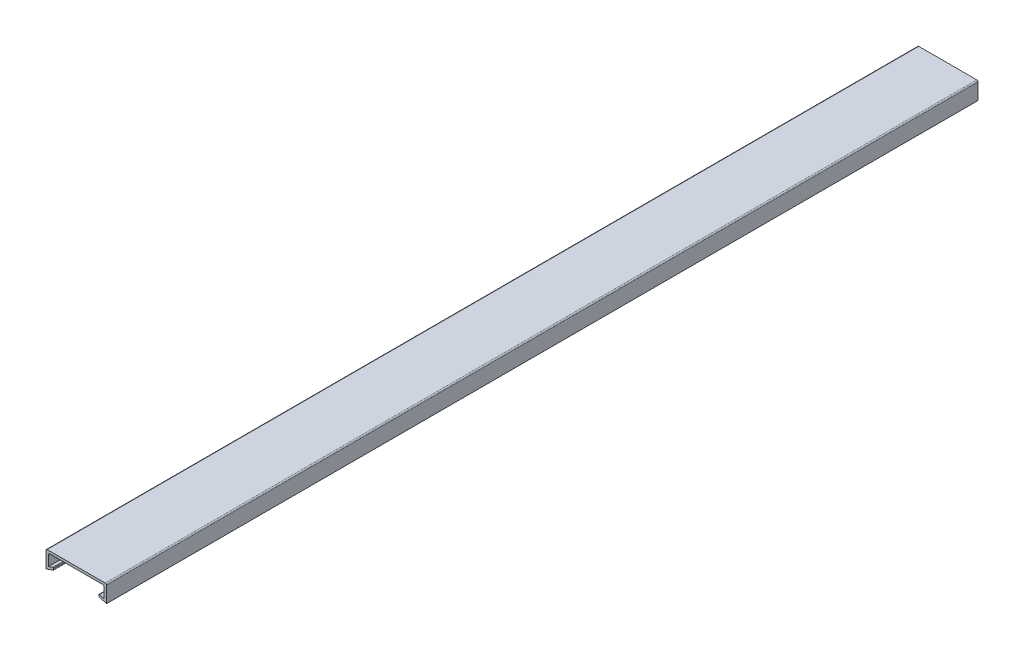
ISO-10303-21;
HEADER;
FILE_DESCRIPTION(('STEP AP214'),'2;1');
FILE_NAME('part.step','',(''),(''),'','','');
FILE_SCHEMA(('AUTOMOTIVE_DESIGN { 1 0 10303 214 1 1 1 1 }'));
ENDSEC;
DATA;
#1=APPLICATION_CONTEXT('core data for automotive mechanical design processes');
#2=APPLICATION_PROTOCOL_DEFINITION('international standard','automotive_design',2000,#1);
#3=PRODUCT_CONTEXT('',#1,'mechanical');
#4=PRODUCT('Part','Part','',(#3));
#5=PRODUCT_RELATED_PRODUCT_CATEGORY('part','',(#4));
#6=PRODUCT_DEFINITION_FORMATION('','',#4);
#7=PRODUCT_DEFINITION_CONTEXT('part definition',#1,'design');
#8=PRODUCT_DEFINITION('design','',#6,#7);
#9=PRODUCT_DEFINITION_SHAPE('','',#8);
#10=(LENGTH_UNIT() NAMED_UNIT(*) SI_UNIT(.MILLI.,.METRE.));
#11=(NAMED_UNIT(*) PLANE_ANGLE_UNIT() SI_UNIT($,.RADIAN.));
#12=(NAMED_UNIT(*) SI_UNIT($,.STERADIAN.) SOLID_ANGLE_UNIT());
#13=UNCERTAINTY_MEASURE_WITH_UNIT(LENGTH_MEASURE(1.E-05),#10,'distance_accuracy_value','');
#14=(GEOMETRIC_REPRESENTATION_CONTEXT(3) GLOBAL_UNCERTAINTY_ASSIGNED_CONTEXT((#13)) GLOBAL_UNIT_ASSIGNED_CONTEXT((#10,
#11,#12)) REPRESENTATION_CONTEXT('',''));
#15=CARTESIAN_POINT('',(0.,0.,0.));
#16=DIRECTION('',(0.,0.,1.));
#17=DIRECTION('',(1.,0.,0.));
#18=AXIS2_PLACEMENT_3D('',#15,#16,#17);
#19=CARTESIAN_POINT('',(-12.2,-7.,176.));
#20=DIRECTION('',(1.,0.,0.));
#21=DIRECTION('',(0.,0.,-1.));
#22=AXIS2_PLACEMENT_3D('',#19,#20,#21);
#23=PLANE('',#22);
#24=DIRECTION('',(0.,-1.,0.));
#25=VECTOR('',#24,1.);
#26=CARTESIAN_POINT('',(-12.2,-7.,-176.));
#27=LINE('',#26,#25);
#28=CARTESIAN_POINT('',(-12.2,-0.5,-176.));
#29=VERTEX_POINT('',#28);
#30=CARTESIAN_POINT('',(-12.2,-7.,-176.));
#31=VERTEX_POINT('',#30);
#32=EDGE_CURVE('E200',#29,#31,#27,.T.);
#33=ORIENTED_EDGE('',*,*,#32,.T.);
#34=DIRECTION('',(0.,0.,-1.));
#35=VECTOR('',#34,1.);
#36=CARTESIAN_POINT('',(-12.2,-7.,176.));
#37=LINE('',#36,#35);
#38=CARTESIAN_POINT('',(-12.2,-7.,176.));
#39=VERTEX_POINT('',#38);
#40=EDGE_CURVE('E11',#39,#31,#37,.T.);
#41=ORIENTED_EDGE('',*,*,#40,.F.);
#42=DIRECTION('',(0.,-1.,0.));
#43=VECTOR('',#42,1.);
#44=CARTESIAN_POINT('',(-12.2,-7.,176.));
#45=LINE('',#44,#43);
#46=CARTESIAN_POINT('',(-12.2,-0.5,176.));
#47=VERTEX_POINT('',#46);
#48=EDGE_CURVE('E238',#47,#39,#45,.T.);
#49=ORIENTED_EDGE('',*,*,#48,.F.);
#50=DIRECTION('',(0.,0.,-1.));
#51=VECTOR('',#50,1.);
#52=CARTESIAN_POINT('',(-12.2,-0.5,176.));
#53=LINE('',#52,#51);
#54=EDGE_CURVE('E196',#47,#29,#53,.T.);
#55=ORIENTED_EDGE('',*,*,#54,.T.);
#56=EDGE_LOOP('',(#33,#41,#49,#55));
#57=FACE_BOUND('',#56,.T.);
#58=ADVANCED_FACE('F32',(#57),#23,.F.);
#59=CARTESIAN_POINT('',(-9.33675444679663,-6.04558481559888,176.));
#60=DIRECTION('',(-0.316227766016838,0.948683298050514,0.));
#61=DIRECTION('',(-0.948683298050514,-0.316227766016838,0.));
#62=AXIS2_PLACEMENT_3D('',#59,#60,#61);
#63=PLANE('',#62);
#64=DIRECTION('',(0.948683298050514,0.316227766016838,0.));
#65=VECTOR('',#64,1.);
#66=CARTESIAN_POINT('',(-9.33675444679663,-6.04558481559888,-176.));
#67=LINE('',#66,#65);
#68=CARTESIAN_POINT('',(-9.33675444679663,-6.04558481559888,-176.));
#69=VERTEX_POINT('',#68);
#70=EDGE_CURVE('E203',#31,#69,#67,.T.);
#71=ORIENTED_EDGE('',*,*,#70,.T.);
#72=DIRECTION('',(0.,0.,-1.));
#73=VECTOR('',#72,1.);
#74=CARTESIAN_POINT('',(-9.33675444679663,-6.04558481559888,176.));
#75=LINE('',#74,#73);
#76=CARTESIAN_POINT('',(-9.33675444679663,-6.04558481559888,176.));
#77=VERTEX_POINT('',#76);
#78=EDGE_CURVE('E40',#77,#69,#75,.T.);
#79=ORIENTED_EDGE('',*,*,#78,.F.);
#80=DIRECTION('',(0.948683298050514,0.316227766016838,0.));
#81=VECTOR('',#80,1.);
#82=CARTESIAN_POINT('',(-9.33675444679663,-6.04558481559888,176.));
#83=LINE('',#82,#81);
#84=EDGE_CURVE('E127',#39,#77,#83,.T.);
#85=ORIENTED_EDGE('',*,*,#84,.F.);
#86=ORIENTED_EDGE('',*,*,#40,.T.);
#87=EDGE_LOOP('',(#71,#79,#85,#86));
#88=FACE_BOUND('',#87,.T.);
#89=ADVANCED_FACE('F356',(#88),#63,.F.);
#90=CARTESIAN_POINT('',(-9.4,-5.85584815598877,176.));
#91=DIRECTION('',(0.,0.,-1.));
#92=DIRECTION('',(-1.,0.,0.));
#93=AXIS2_PLACEMENT_3D('',#90,#91,#92);
#94=CYLINDRICAL_SURFACE('',#93,0.199999999999999);
#95=CARTESIAN_POINT('',(-9.4,-5.85584815598877,-176.));
#96=DIRECTION('',(0.,0.,1.));
#97=DIRECTION('',(1.,0.,0.));
#98=AXIS2_PLACEMENT_3D('',#95,#96,#97);
#99=CIRCLE('',#98,0.199999999999999);
#100=CARTESIAN_POINT('',(-9.2,-5.85584815598877,-176.));
#101=VERTEX_POINT('',#100);
#102=EDGE_CURVE('E205',#69,#101,#99,.T.);
#103=ORIENTED_EDGE('',*,*,#102,.T.);
#104=DIRECTION('',(0.,0.,-1.));
#105=VECTOR('',#104,1.);
#106=CARTESIAN_POINT('',(-9.2,-5.85584815598877,176.));
#107=LINE('',#106,#105);
#108=CARTESIAN_POINT('',(-9.2,-5.85584815598877,176.));
#109=VERTEX_POINT('',#108);
#110=EDGE_CURVE('E281',#109,#101,#107,.T.);
#111=ORIENTED_EDGE('',*,*,#110,.F.);
#112=CARTESIAN_POINT('',(-9.4,-5.85584815598877,176.));
#113=DIRECTION('',(0.,0.,1.));
#114=DIRECTION('',(1.,0.,0.));
#115=AXIS2_PLACEMENT_3D('',#112,#113,#114);
#116=CIRCLE('',#115,0.199999999999999);
#117=EDGE_CURVE('E289',#77,#109,#116,.T.);
#118=ORIENTED_EDGE('',*,*,#117,.F.);
#119=ORIENTED_EDGE('',*,*,#78,.T.);
#120=EDGE_LOOP('',(#103,#111,#118,#119));
#121=FACE_BOUND('',#120,.T.);
#122=ADVANCED_FACE('F287',(#121),#94,.T.);
#123=CARTESIAN_POINT('',(-9.2,-5.27748517734455,176.));
#124=DIRECTION('',(-1.,0.,0.));
#125=DIRECTION('',(0.,0.,1.));
#126=AXIS2_PLACEMENT_3D('',#123,#124,#125);
#127=PLANE('',#126);
#128=DIRECTION('',(0.,1.,0.));
#129=VECTOR('',#128,1.);
#130=CARTESIAN_POINT('',(-9.2,-5.27748517734455,-176.));
#131=LINE('',#130,#129);
#132=CARTESIAN_POINT('',(-9.2,-5.27748517734455,-176.));
#133=VERTEX_POINT('',#132);
#134=EDGE_CURVE('E207',#101,#133,#131,.T.);
#135=ORIENTED_EDGE('',*,*,#134,.T.);
#136=DIRECTION('',(0.,0.,-1.));
#137=VECTOR('',#136,1.);
#138=CARTESIAN_POINT('',(-9.2,-5.27748517734455,176.));
#139=LINE('',#138,#137);
#140=CARTESIAN_POINT('',(-9.2,-5.27748517734455,176.));
#141=VERTEX_POINT('',#140);
#142=EDGE_CURVE('E278',#141,#133,#139,.T.);
#143=ORIENTED_EDGE('',*,*,#142,.F.);
#144=DIRECTION('',(0.,1.,0.));
#145=VECTOR('',#144,1.);
#146=CARTESIAN_POINT('',(-9.2,-5.27748517734455,176.));
#147=LINE('',#146,#145);
#148=EDGE_CURVE('E307',#109,#141,#147,.T.);
#149=ORIENTED_EDGE('',*,*,#148,.F.);
#150=ORIENTED_EDGE('',*,*,#110,.T.);
#151=EDGE_LOOP('',(#135,#143,#149,#150));
#152=FACE_BOUND('',#151,.T.);
#153=ADVANCED_FACE('F298',(#152),#127,.F.);
#154=CARTESIAN_POINT('',(-9.4,-5.27748517734455,176.));
#155=DIRECTION('',(0.,0.,-1.));
#156=DIRECTION('',(-1.,0.,0.));
#157=AXIS2_PLACEMENT_3D('',#154,#155,#156);
#158=CYLINDRICAL_SURFACE('',#157,0.2);
#159=CARTESIAN_POINT('',(-9.4,-5.27748517734455,-176.));
#160=DIRECTION('',(0.,0.,1.));
#161=DIRECTION('',(-1.,0.,0.));
#162=AXIS2_PLACEMENT_3D('',#159,#160,#161);
#163=CIRCLE('',#162,0.2);
#164=CARTESIAN_POINT('',(-9.46324555320337,-5.08774851773445,-176.));
#165=VERTEX_POINT('',#164);
#166=EDGE_CURVE('E209',#133,#165,#163,.T.);
#167=ORIENTED_EDGE('',*,*,#166,.T.);
#168=DIRECTION('',(0.,0.,-1.));
#169=VECTOR('',#168,1.);
#170=CARTESIAN_POINT('',(-9.46324555320337,-5.08774851773445,176.));
#171=LINE('',#170,#169);
#172=CARTESIAN_POINT('',(-9.46324555320337,-5.08774851773445,176.));
#173=VERTEX_POINT('',#172);
#174=EDGE_CURVE('E275',#173,#165,#171,.T.);
#175=ORIENTED_EDGE('',*,*,#174,.F.);
#176=CARTESIAN_POINT('',(-9.4,-5.27748517734455,176.));
#177=DIRECTION('',(0.,0.,1.));
#178=DIRECTION('',(-1.,0.,0.));
#179=AXIS2_PLACEMENT_3D('',#176,#177,#178);
#180=CIRCLE('',#179,0.2);
#181=EDGE_CURVE('E304',#141,#173,#180,.T.);
#182=ORIENTED_EDGE('',*,*,#181,.F.);
#183=ORIENTED_EDGE('',*,*,#142,.T.);
#184=EDGE_LOOP('',(#167,#175,#182,#183));
#185=FACE_BOUND('',#184,.T.);
#186=ADVANCED_FACE('F302',(#185),#158,.T.);
#187=CARTESIAN_POINT('',(-11.2,-5.66666666666666,176.));
#188=DIRECTION('',(0.316227766016839,-0.948683298050514,0.));
#189=DIRECTION('',(0.948683298050514,0.316227766016839,0.));
#190=AXIS2_PLACEMENT_3D('',#187,#188,#189);
#191=PLANE('',#190);
#192=DIRECTION('',(-0.948683298050514,-0.316227766016838,0.));
#193=VECTOR('',#192,1.);
#194=CARTESIAN_POINT('',(-11.2,-5.66666666666666,-176.));
#195=LINE('',#194,#193);
#196=CARTESIAN_POINT('',(-11.2,-5.66666666666666,-176.));
#197=VERTEX_POINT('',#196);
#198=EDGE_CURVE('E211',#165,#197,#195,.T.);
#199=ORIENTED_EDGE('',*,*,#198,.T.);
#200=DIRECTION('',(0.,0.,-1.));
#201=VECTOR('',#200,1.);
#202=CARTESIAN_POINT('',(-11.2,-5.66666666666666,176.));
#203=LINE('',#202,#201);
#204=CARTESIAN_POINT('',(-11.2,-5.66666666666666,176.));
#205=VERTEX_POINT('',#204);
#206=EDGE_CURVE('E272',#205,#197,#203,.T.);
#207=ORIENTED_EDGE('',*,*,#206,.F.);
#208=DIRECTION('',(-0.948683298050514,-0.316227766016838,0.));
#209=VECTOR('',#208,1.);
#210=CARTESIAN_POINT('',(-11.2,-5.66666666666666,176.));
#211=LINE('',#210,#209);
#212=EDGE_CURVE('E306',#173,#205,#211,.T.);
#213=ORIENTED_EDGE('',*,*,#212,.F.);
#214=ORIENTED_EDGE('',*,*,#174,.T.);
#215=EDGE_LOOP('',(#199,#207,#213,#214));
#216=FACE_BOUND('',#215,.T.);
#217=ADVANCED_FACE('F369',(#216),#191,.F.);
#218=CARTESIAN_POINT('',(-11.2,-1.5,176.));
#219=DIRECTION('',(-1.,0.,0.));
#220=DIRECTION('',(0.,0.,1.));
#221=AXIS2_PLACEMENT_3D('',#218,#219,#220);
#222=PLANE('',#221);
#223=DIRECTION('',(0.,1.,0.));
#224=VECTOR('',#223,1.);
#225=CARTESIAN_POINT('',(-11.2,-1.5,-176.));
#226=LINE('',#225,#224);
#227=CARTESIAN_POINT('',(-11.2,-1.5,-176.));
#228=VERTEX_POINT('',#227);
#229=EDGE_CURVE('E213',#197,#228,#226,.T.);
#230=ORIENTED_EDGE('',*,*,#229,.T.);
#231=DIRECTION('',(0.,0.,-1.));
#232=VECTOR('',#231,1.);
#233=CARTESIAN_POINT('',(-11.2,-1.5,176.));
#234=LINE('',#233,#232);
#235=CARTESIAN_POINT('',(-11.2,-1.5,176.));
#236=VERTEX_POINT('',#235);
#237=EDGE_CURVE('E269',#236,#228,#234,.T.);
#238=ORIENTED_EDGE('',*,*,#237,.F.);
#239=DIRECTION('',(0.,1.,0.));
#240=VECTOR('',#239,1.);
#241=CARTESIAN_POINT('',(-11.2,-1.5,176.));
#242=LINE('',#241,#240);
#243=EDGE_CURVE('E309',#205,#236,#242,.T.);
#244=ORIENTED_EDGE('',*,*,#243,.F.);
#245=ORIENTED_EDGE('',*,*,#206,.T.);
#246=EDGE_LOOP('',(#230,#238,#244,#245));
#247=FACE_BOUND('',#246,.T.);
#248=ADVANCED_FACE('F372',(#247),#222,.F.);
#249=CARTESIAN_POINT('',(-10.7,-1.5,176.));
#250=DIRECTION('',(0.,0.,-1.));
#251=DIRECTION('',(-1.,0.,0.));
#252=AXIS2_PLACEMENT_3D('',#249,#250,#251);
#253=CYLINDRICAL_SURFACE('',#252,0.5);
#254=CARTESIAN_POINT('',(-10.7,-1.5,-176.));
#255=DIRECTION('',(0.,0.,-1.));
#256=DIRECTION('',(1.,0.,0.));
#257=AXIS2_PLACEMENT_3D('',#254,#255,#256);
#258=CIRCLE('',#257,0.5);
#259=CARTESIAN_POINT('',(-10.7,-1.,-176.));
#260=VERTEX_POINT('',#259);
#261=EDGE_CURVE('E215',#228,#260,#258,.T.);
#262=ORIENTED_EDGE('',*,*,#261,.T.);
#263=DIRECTION('',(0.,0.,-1.));
#264=VECTOR('',#263,1.);
#265=CARTESIAN_POINT('',(-10.7,-1.,176.));
#266=LINE('',#265,#264);
#267=CARTESIAN_POINT('',(-10.7,-1.,176.));
#268=VERTEX_POINT('',#267);
#269=EDGE_CURVE('E266',#268,#260,#266,.T.);
#270=ORIENTED_EDGE('',*,*,#269,.F.);
#271=CARTESIAN_POINT('',(-10.7,-1.5,176.));
#272=DIRECTION('',(0.,0.,-1.));
#273=DIRECTION('',(1.,0.,0.));
#274=AXIS2_PLACEMENT_3D('',#271,#272,#273);
#275=CIRCLE('',#274,0.5);
#276=EDGE_CURVE('E315',#236,#268,#275,.T.);
#277=ORIENTED_EDGE('',*,*,#276,.F.);
#278=ORIENTED_EDGE('',*,*,#237,.T.);
#279=EDGE_LOOP('',(#262,#270,#277,#278));
#280=FACE_BOUND('',#279,.T.);
#281=ADVANCED_FACE('F376',(#280),#253,.F.);
#282=CARTESIAN_POINT('',(10.7,-1.,176.));
#283=DIRECTION('',(0.,1.,0.));
#284=DIRECTION('',(-1.,0.,0.));
#285=AXIS2_PLACEMENT_3D('',#282,#283,#284);
#286=PLANE('',#285);
#287=DIRECTION('',(1.,0.,0.));
#288=VECTOR('',#287,1.);
#289=CARTESIAN_POINT('',(10.7,-1.,-176.));
#290=LINE('',#289,#288);
#291=CARTESIAN_POINT('',(10.7,-1.,-176.));
#292=VERTEX_POINT('',#291);
#293=EDGE_CURVE('E217',#260,#292,#290,.T.);
#294=ORIENTED_EDGE('',*,*,#293,.T.);
#295=DIRECTION('',(0.,0.,-1.));
#296=VECTOR('',#295,1.);
#297=CARTESIAN_POINT('',(10.7,-1.,176.));
#298=LINE('',#297,#296);
#299=CARTESIAN_POINT('',(10.7,-1.,176.));
#300=VERTEX_POINT('',#299);
#301=EDGE_CURVE('E263',#300,#292,#298,.T.);
#302=ORIENTED_EDGE('',*,*,#301,.F.);
#303=DIRECTION('',(1.,0.,0.));
#304=VECTOR('',#303,1.);
#305=CARTESIAN_POINT('',(10.7,-1.,176.));
#306=LINE('',#305,#304);
#307=EDGE_CURVE('E317',#268,#300,#306,.T.);
#308=ORIENTED_EDGE('',*,*,#307,.F.);
#309=ORIENTED_EDGE('',*,*,#269,.T.);
#310=EDGE_LOOP('',(#294,#302,#308,#309));
#311=FACE_BOUND('',#310,.T.);
#312=ADVANCED_FACE('F380',(#311),#286,.F.);
#313=CARTESIAN_POINT('',(10.7,-1.5,176.));
#314=DIRECTION('',(0.,0.,-1.));
#315=DIRECTION('',(-1.,0.,0.));
#316=AXIS2_PLACEMENT_3D('',#313,#314,#315);
#317=CYLINDRICAL_SURFACE('',#316,0.5);
#318=CARTESIAN_POINT('',(10.7,-1.5,-176.));
#319=DIRECTION('',(0.,0.,-1.));
#320=DIRECTION('',(1.,0.,0.));
#321=AXIS2_PLACEMENT_3D('',#318,#319,#320);
#322=CIRCLE('',#321,0.5);
#323=CARTESIAN_POINT('',(11.2,-1.5,-176.));
#324=VERTEX_POINT('',#323);
#325=EDGE_CURVE('E219',#292,#324,#322,.T.);
#326=ORIENTED_EDGE('',*,*,#325,.T.);
#327=DIRECTION('',(0.,0.,-1.));
#328=VECTOR('',#327,1.);
#329=CARTESIAN_POINT('',(11.2,-1.5,176.));
#330=LINE('',#329,#328);
#331=CARTESIAN_POINT('',(11.2,-1.5,176.));
#332=VERTEX_POINT('',#331);
#333=EDGE_CURVE('E260',#332,#324,#330,.T.);
#334=ORIENTED_EDGE('',*,*,#333,.F.);
#335=CARTESIAN_POINT('',(10.7,-1.5,176.));
#336=DIRECTION('',(0.,0.,-1.));
#337=DIRECTION('',(1.,0.,0.));
#338=AXIS2_PLACEMENT_3D('',#335,#336,#337);
#339=CIRCLE('',#338,0.5);
#340=EDGE_CURVE('E319',#300,#332,#339,.T.);
#341=ORIENTED_EDGE('',*,*,#340,.F.);
#342=ORIENTED_EDGE('',*,*,#301,.T.);
#343=EDGE_LOOP('',(#326,#334,#341,#342));
#344=FACE_BOUND('',#343,.T.);
#345=ADVANCED_FACE('F384',(#344),#317,.F.);
#346=CARTESIAN_POINT('',(11.2,-5.66666666666666,176.));
#347=DIRECTION('',(1.,0.,0.));
#348=DIRECTION('',(0.,0.,-1.));
#349=AXIS2_PLACEMENT_3D('',#346,#347,#348);
#350=PLANE('',#349);
#351=DIRECTION('',(0.,-1.,0.));
#352=VECTOR('',#351,1.);
#353=CARTESIAN_POINT('',(11.2,-5.66666666666666,-176.));
#354=LINE('',#353,#352);
#355=CARTESIAN_POINT('',(11.2,-5.66666666666666,-176.));
#356=VERTEX_POINT('',#355);
#357=EDGE_CURVE('E221',#324,#356,#354,.T.);
#358=ORIENTED_EDGE('',*,*,#357,.T.);
#359=DIRECTION('',(0.,0.,-1.));
#360=VECTOR('',#359,1.);
#361=CARTESIAN_POINT('',(11.2,-5.66666666666666,176.));
#362=LINE('',#361,#360);
#363=CARTESIAN_POINT('',(11.2,-5.66666666666666,176.));
#364=VERTEX_POINT('',#363);
#365=EDGE_CURVE('E257',#364,#356,#362,.T.);
#366=ORIENTED_EDGE('',*,*,#365,.F.);
#367=DIRECTION('',(0.,-1.,0.));
#368=VECTOR('',#367,1.);
#369=CARTESIAN_POINT('',(11.2,-5.66666666666666,176.));
#370=LINE('',#369,#368);
#371=EDGE_CURVE('E321',#332,#364,#370,.T.);
#372=ORIENTED_EDGE('',*,*,#371,.F.);
#373=ORIENTED_EDGE('',*,*,#333,.T.);
#374=EDGE_LOOP('',(#358,#366,#372,#373));
#375=FACE_BOUND('',#374,.T.);
#376=ADVANCED_FACE('F388',(#375),#350,.F.);
#377=CARTESIAN_POINT('',(11.2,-5.66666666666666,176.));
#378=DIRECTION('',(-0.316227766016839,-0.948683298050514,0.));
#379=DIRECTION('',(0.948683298050514,-0.316227766016839,0.));
#380=AXIS2_PLACEMENT_3D('',#377,#378,#379);
#381=PLANE('',#380);
#382=DIRECTION('',(-0.948683298050514,0.316227766016838,0.));
#383=VECTOR('',#382,1.);
#384=CARTESIAN_POINT('',(11.2,-5.66666666666666,-176.));
#385=LINE('',#384,#383);
#386=CARTESIAN_POINT('',(9.46324555320337,-5.08774851773445,-176.));
#387=VERTEX_POINT('',#386);
#388=EDGE_CURVE('E223',#356,#387,#385,.T.);
#389=ORIENTED_EDGE('',*,*,#388,.T.);
#390=DIRECTION('',(0.,0.,-1.));
#391=VECTOR('',#390,1.);
#392=CARTESIAN_POINT('',(9.46324555320337,-5.08774851773445,176.));
#393=LINE('',#392,#391);
#394=CARTESIAN_POINT('',(9.46324555320337,-5.08774851773445,176.));
#395=VERTEX_POINT('',#394);
#396=EDGE_CURVE('E254',#395,#387,#393,.T.);
#397=ORIENTED_EDGE('',*,*,#396,.F.);
#398=DIRECTION('',(-0.948683298050514,0.316227766016838,0.));
#399=VECTOR('',#398,1.);
#400=CARTESIAN_POINT('',(11.2,-5.66666666666666,176.));
#401=LINE('',#400,#399);
#402=EDGE_CURVE('E323',#364,#395,#401,.T.);
#403=ORIENTED_EDGE('',*,*,#402,.F.);
#404=ORIENTED_EDGE('',*,*,#365,.T.);
#405=EDGE_LOOP('',(#389,#397,#403,#404));
#406=FACE_BOUND('',#405,.T.);
#407=ADVANCED_FACE('F392',(#406),#381,.F.);
#408=CARTESIAN_POINT('',(9.4,-5.27748517734455,176.));
#409=DIRECTION('',(0.,0.,-1.));
#410=DIRECTION('',(-1.,0.,0.));
#411=AXIS2_PLACEMENT_3D('',#408,#409,#410);
#412=CYLINDRICAL_SURFACE('',#411,0.2);
#413=CARTESIAN_POINT('',(9.4,-5.27748517734455,-176.));
#414=DIRECTION('',(0.,0.,1.));
#415=DIRECTION('',(-1.,0.,0.));
#416=AXIS2_PLACEMENT_3D('',#413,#414,#415);
#417=CIRCLE('',#416,0.2);
#418=CARTESIAN_POINT('',(9.2,-5.27748517734455,-176.));
#419=VERTEX_POINT('',#418);
#420=EDGE_CURVE('E225',#387,#419,#417,.T.);
#421=ORIENTED_EDGE('',*,*,#420,.T.);
#422=DIRECTION('',(0.,0.,-1.));
#423=VECTOR('',#422,1.);
#424=CARTESIAN_POINT('',(9.2,-5.27748517734455,176.));
#425=LINE('',#424,#423);
#426=CARTESIAN_POINT('',(9.2,-5.27748517734455,176.));
#427=VERTEX_POINT('',#426);
#428=EDGE_CURVE('E251',#427,#419,#425,.T.);
#429=ORIENTED_EDGE('',*,*,#428,.F.);
#430=CARTESIAN_POINT('',(9.4,-5.27748517734455,176.));
#431=DIRECTION('',(0.,0.,1.));
#432=DIRECTION('',(-1.,0.,0.));
#433=AXIS2_PLACEMENT_3D('',#430,#431,#432);
#434=CIRCLE('',#433,0.2);
#435=EDGE_CURVE('E325',#395,#427,#434,.T.);
#436=ORIENTED_EDGE('',*,*,#435,.F.);
#437=ORIENTED_EDGE('',*,*,#396,.T.);
#438=EDGE_LOOP('',(#421,#429,#436,#437));
#439=FACE_BOUND('',#438,.T.);
#440=ADVANCED_FACE('F396',(#439),#412,.T.);
#441=CARTESIAN_POINT('',(9.2,-5.27748517734455,176.));
#442=DIRECTION('',(1.,0.,0.));
#443=DIRECTION('',(0.,0.,-1.));
#444=AXIS2_PLACEMENT_3D('',#441,#442,#443);
#445=PLANE('',#444);
#446=DIRECTION('',(0.,-1.,0.));
#447=VECTOR('',#446,1.);
#448=CARTESIAN_POINT('',(9.2,-5.27748517734455,-176.));
#449=LINE('',#448,#447);
#450=CARTESIAN_POINT('',(9.2,-5.85584815598877,-176.));
#451=VERTEX_POINT('',#450);
#452=EDGE_CURVE('E227',#419,#451,#449,.T.);
#453=ORIENTED_EDGE('',*,*,#452,.T.);
#454=DIRECTION('',(0.,0.,-1.));
#455=VECTOR('',#454,1.);
#456=CARTESIAN_POINT('',(9.2,-5.85584815598877,176.));
#457=LINE('',#456,#455);
#458=CARTESIAN_POINT('',(9.2,-5.85584815598877,176.));
#459=VERTEX_POINT('',#458);
#460=EDGE_CURVE('E248',#459,#451,#457,.T.);
#461=ORIENTED_EDGE('',*,*,#460,.F.);
#462=DIRECTION('',(0.,-1.,0.));
#463=VECTOR('',#462,1.);
#464=CARTESIAN_POINT('',(9.2,-5.27748517734455,176.));
#465=LINE('',#464,#463);
#466=EDGE_CURVE('E327',#427,#459,#465,.T.);
#467=ORIENTED_EDGE('',*,*,#466,.F.);
#468=ORIENTED_EDGE('',*,*,#428,.T.);
#469=EDGE_LOOP('',(#453,#461,#467,#468));
#470=FACE_BOUND('',#469,.T.);
#471=ADVANCED_FACE('F400',(#470),#445,.F.);
#472=CARTESIAN_POINT('',(9.4,-5.85584815598877,176.));
#473=DIRECTION('',(0.,0.,-1.));
#474=DIRECTION('',(-1.,0.,0.));
#475=AXIS2_PLACEMENT_3D('',#472,#473,#474);
#476=CYLINDRICAL_SURFACE('',#475,0.199999999999999);
#477=CARTESIAN_POINT('',(9.4,-5.85584815598877,-176.));
#478=DIRECTION('',(0.,0.,1.));
#479=DIRECTION('',(1.,0.,0.));
#480=AXIS2_PLACEMENT_3D('',#477,#478,#479);
#481=CIRCLE('',#480,0.199999999999999);
#482=CARTESIAN_POINT('',(9.33675444679663,-6.04558481559888,-176.));
#483=VERTEX_POINT('',#482);
#484=EDGE_CURVE('E229',#451,#483,#481,.T.);
#485=ORIENTED_EDGE('',*,*,#484,.T.);
#486=DIRECTION('',(0.,0.,-1.));
#487=VECTOR('',#486,1.);
#488=CARTESIAN_POINT('',(9.33675444679663,-6.04558481559888,176.));
#489=LINE('',#488,#487);
#490=CARTESIAN_POINT('',(9.33675444679663,-6.04558481559888,176.));
#491=VERTEX_POINT('',#490);
#492=EDGE_CURVE('E245',#491,#483,#489,.T.);
#493=ORIENTED_EDGE('',*,*,#492,.F.);
#494=CARTESIAN_POINT('',(9.4,-5.85584815598877,176.));
#495=DIRECTION('',(0.,0.,1.));
#496=DIRECTION('',(1.,0.,0.));
#497=AXIS2_PLACEMENT_3D('',#494,#495,#496);
#498=CIRCLE('',#497,0.199999999999999);
#499=EDGE_CURVE('E329',#459,#491,#498,.T.);
#500=ORIENTED_EDGE('',*,*,#499,.F.);
#501=ORIENTED_EDGE('',*,*,#460,.T.);
#502=EDGE_LOOP('',(#485,#493,#500,#501));
#503=FACE_BOUND('',#502,.T.);
#504=ADVANCED_FACE('F404',(#503),#476,.T.);
#505=CARTESIAN_POINT('',(9.33675444679663,-6.04558481559888,176.));
#506=DIRECTION('',(0.316227766016838,0.948683298050514,0.));
#507=DIRECTION('',(-0.948683298050514,0.316227766016838,0.));
#508=AXIS2_PLACEMENT_3D('',#505,#506,#507);
#509=PLANE('',#508);
#510=DIRECTION('',(0.948683298050514,-0.316227766016838,0.));
#511=VECTOR('',#510,1.);
#512=CARTESIAN_POINT('',(9.33675444679663,-6.04558481559888,-176.));
#513=LINE('',#512,#511);
#514=CARTESIAN_POINT('',(12.2,-7.,-176.));
#515=VERTEX_POINT('',#514);
#516=EDGE_CURVE('E231',#483,#515,#513,.T.);
#517=ORIENTED_EDGE('',*,*,#516,.T.);
#518=DIRECTION('',(0.,0.,-1.));
#519=VECTOR('',#518,1.);
#520=CARTESIAN_POINT('',(12.2,-7.,176.));
#521=LINE('',#520,#519);
#522=CARTESIAN_POINT('',(12.2,-7.,176.));
#523=VERTEX_POINT('',#522);
#524=EDGE_CURVE('E242',#523,#515,#521,.T.);
#525=ORIENTED_EDGE('',*,*,#524,.F.);
#526=DIRECTION('',(0.948683298050514,-0.316227766016838,0.));
#527=VECTOR('',#526,1.);
#528=CARTESIAN_POINT('',(9.33675444679663,-6.04558481559888,176.));
#529=LINE('',#528,#527);
#530=EDGE_CURVE('E331',#491,#523,#529,.T.);
#531=ORIENTED_EDGE('',*,*,#530,.F.);
#532=ORIENTED_EDGE('',*,*,#492,.T.);
#533=EDGE_LOOP('',(#517,#525,#531,#532));
#534=FACE_BOUND('',#533,.T.);
#535=ADVANCED_FACE('F337',(#534),#509,.F.);
#536=CARTESIAN_POINT('',(12.2,-0.5,176.));
#537=DIRECTION('',(-1.,0.,0.));
#538=DIRECTION('',(0.,0.,1.));
#539=AXIS2_PLACEMENT_3D('',#536,#537,#538);
#540=PLANE('',#539);
#541=DIRECTION('',(0.,1.,0.));
#542=VECTOR('',#541,1.);
#543=CARTESIAN_POINT('',(12.2,-0.5,-176.));
#544=LINE('',#543,#542);
#545=CARTESIAN_POINT('',(12.2,-0.5,-176.));
#546=VERTEX_POINT('',#545);
#547=EDGE_CURVE('E233',#515,#546,#544,.T.);
#548=ORIENTED_EDGE('',*,*,#547,.T.);
#549=DIRECTION('',(0.,0.,-1.));
#550=VECTOR('',#549,1.);
#551=CARTESIAN_POINT('',(12.2,-0.5,176.));
#552=LINE('',#551,#550);
#553=CARTESIAN_POINT('',(12.2,-0.5,176.));
#554=VERTEX_POINT('',#553);
#555=EDGE_CURVE('E191',#554,#546,#552,.T.);
#556=ORIENTED_EDGE('',*,*,#555,.F.);
#557=DIRECTION('',(0.,1.,0.));
#558=VECTOR('',#557,1.);
#559=CARTESIAN_POINT('',(12.2,-0.5,176.));
#560=LINE('',#559,#558);
#561=EDGE_CURVE('E182',#523,#554,#560,.T.);
#562=ORIENTED_EDGE('',*,*,#561,.F.);
#563=ORIENTED_EDGE('',*,*,#524,.T.);
#564=EDGE_LOOP('',(#548,#556,#562,#563));
#565=FACE_BOUND('',#564,.T.);
#566=ADVANCED_FACE('F341',(#565),#540,.F.);
#567=CARTESIAN_POINT('',(11.7,-0.5,176.));
#568=DIRECTION('',(0.,0.,-1.));
#569=DIRECTION('',(-1.,0.,0.));
#570=AXIS2_PLACEMENT_3D('',#567,#568,#569);
#571=CYLINDRICAL_SURFACE('',#570,0.5);
#572=CARTESIAN_POINT('',(11.7,-0.5,-176.));
#573=DIRECTION('',(0.,0.,1.));
#574=DIRECTION('',(-1.,0.,0.));
#575=AXIS2_PLACEMENT_3D('',#572,#573,#574);
#576=CIRCLE('',#575,0.5);
#577=CARTESIAN_POINT('',(11.7,0.,-176.));
#578=VERTEX_POINT('',#577);
#579=EDGE_CURVE('E190',#546,#578,#576,.T.);
#580=ORIENTED_EDGE('',*,*,#579,.T.);
#581=DIRECTION('',(0.,0.,-1.));
#582=VECTOR('',#581,1.);
#583=CARTESIAN_POINT('',(11.7,0.,176.));
#584=LINE('',#583,#582);
#585=CARTESIAN_POINT('',(11.7,0.,176.));
#586=VERTEX_POINT('',#585);
#587=EDGE_CURVE('E187',#586,#578,#584,.T.);
#588=ORIENTED_EDGE('',*,*,#587,.F.);
#589=CARTESIAN_POINT('',(11.7,-0.5,176.));
#590=DIRECTION('',(0.,0.,1.));
#591=DIRECTION('',(-1.,0.,0.));
#592=AXIS2_PLACEMENT_3D('',#589,#590,#591);
#593=CIRCLE('',#592,0.5);
#594=EDGE_CURVE('E176',#554,#586,#593,.T.);
#595=ORIENTED_EDGE('',*,*,#594,.F.);
#596=ORIENTED_EDGE('',*,*,#555,.T.);
#597=EDGE_LOOP('',(#580,#588,#595,#596));
#598=FACE_BOUND('',#597,.T.);
#599=ADVANCED_FACE('F188',(#598),#571,.T.);
#600=CARTESIAN_POINT('',(-11.7,0.,176.));
#601=DIRECTION('',(0.,-1.,0.));
#602=DIRECTION('',(0.,0.,-1.));
#603=AXIS2_PLACEMENT_3D('',#600,#601,#602);
#604=PLANE('',#603);
#605=DIRECTION('',(-1.,0.,0.));
#606=VECTOR('',#605,1.);
#607=CARTESIAN_POINT('',(-11.7,0.,-176.));
#608=LINE('',#607,#606);
#609=CARTESIAN_POINT('',(-11.7,0.,-176.));
#610=VERTEX_POINT('',#609);
#611=EDGE_CURVE('E113',#578,#610,#608,.T.);
#612=ORIENTED_EDGE('',*,*,#611,.T.);
#613=DIRECTION('',(0.,0.,-1.));
#614=VECTOR('',#613,1.);
#615=CARTESIAN_POINT('',(-11.7,0.,176.));
#616=LINE('',#615,#614);
#617=CARTESIAN_POINT('',(-11.7,0.,176.));
#618=VERTEX_POINT('',#617);
#619=EDGE_CURVE('E192',#618,#610,#616,.T.);
#620=ORIENTED_EDGE('',*,*,#619,.F.);
#621=DIRECTION('',(-1.,0.,0.));
#622=VECTOR('',#621,1.);
#623=CARTESIAN_POINT('',(-11.7,0.,176.));
#624=LINE('',#623,#622);
#625=EDGE_CURVE('E180',#586,#618,#624,.T.);
#626=ORIENTED_EDGE('',*,*,#625,.F.);
#627=ORIENTED_EDGE('',*,*,#587,.T.);
#628=EDGE_LOOP('',(#612,#620,#626,#627));
#629=FACE_BOUND('',#628,.T.);
#630=ADVANCED_FACE('F194',(#629),#604,.F.);
#631=CARTESIAN_POINT('',(-11.7,-0.5,176.));
#632=DIRECTION('',(0.,0.,-1.));
#633=DIRECTION('',(-1.,0.,0.));
#634=AXIS2_PLACEMENT_3D('',#631,#632,#633);
#635=CYLINDRICAL_SURFACE('',#634,0.5);
#636=CARTESIAN_POINT('',(-11.7,-0.5,-176.));
#637=DIRECTION('',(0.,0.,1.));
#638=DIRECTION('',(-1.,0.,0.));
#639=AXIS2_PLACEMENT_3D('',#636,#637,#638);
#640=CIRCLE('',#639,0.5);
#641=EDGE_CURVE('E119',#610,#29,#640,.T.);
#642=ORIENTED_EDGE('',*,*,#641,.T.);
#643=ORIENTED_EDGE('',*,*,#54,.F.);
#644=CARTESIAN_POINT('',(-11.7,-0.5,176.));
#645=DIRECTION('',(0.,0.,1.));
#646=DIRECTION('',(-1.,0.,0.));
#647=AXIS2_PLACEMENT_3D('',#644,#645,#646);
#648=CIRCLE('',#647,0.5);
#649=EDGE_CURVE('E48',#618,#47,#648,.T.);
#650=ORIENTED_EDGE('',*,*,#649,.F.);
#651=ORIENTED_EDGE('',*,*,#619,.T.);
#652=EDGE_LOOP('',(#642,#643,#650,#651));
#653=FACE_BOUND('',#652,.T.);
#654=ADVANCED_FACE('F345',(#653),#635,.T.);
#655=CARTESIAN_POINT('',(-11.7,-0.5,176.));
#656=DIRECTION('',(0.,0.,-1.));
#657=DIRECTION('',(-1.,0.,0.));
#658=AXIS2_PLACEMENT_3D('',#655,#656,#657);
#659=PLANE('',#658);
#660=ORIENTED_EDGE('',*,*,#48,.T.);
#661=ORIENTED_EDGE('',*,*,#84,.T.);
#662=ORIENTED_EDGE('',*,*,#117,.T.);
#663=ORIENTED_EDGE('',*,*,#148,.T.);
#664=ORIENTED_EDGE('',*,*,#181,.T.);
#665=ORIENTED_EDGE('',*,*,#212,.T.);
#666=ORIENTED_EDGE('',*,*,#243,.T.);
#667=ORIENTED_EDGE('',*,*,#276,.T.);
#668=ORIENTED_EDGE('',*,*,#307,.T.);
#669=ORIENTED_EDGE('',*,*,#340,.T.);
#670=ORIENTED_EDGE('',*,*,#371,.T.);
#671=ORIENTED_EDGE('',*,*,#402,.T.);
#672=ORIENTED_EDGE('',*,*,#435,.T.);
#673=ORIENTED_EDGE('',*,*,#466,.T.);
#674=ORIENTED_EDGE('',*,*,#499,.T.);
#675=ORIENTED_EDGE('',*,*,#530,.T.);
#676=ORIENTED_EDGE('',*,*,#561,.T.);
#677=ORIENTED_EDGE('',*,*,#594,.T.);
#678=ORIENTED_EDGE('',*,*,#625,.T.);
#679=ORIENTED_EDGE('',*,*,#649,.T.);
#680=EDGE_LOOP('',(#660,#661,#662,#663,#664,#665,#666,#667,#668,#669,#670,#671,#672,#673,#674,
#675,#676,#677,#678,#679));
#681=FACE_BOUND('',#680,.T.);
#682=ADVANCED_FACE('F178',(#681),#659,.F.);
#683=CARTESIAN_POINT('',(-11.7,-0.5,-176.));
#684=DIRECTION('',(0.,0.,-1.));
#685=DIRECTION('',(-1.,0.,0.));
#686=AXIS2_PLACEMENT_3D('',#683,#684,#685);
#687=PLANE('',#686);
#688=ORIENTED_EDGE('',*,*,#32,.F.);
#689=ORIENTED_EDGE('',*,*,#641,.F.);
#690=ORIENTED_EDGE('',*,*,#611,.F.);
#691=ORIENTED_EDGE('',*,*,#579,.F.);
#692=ORIENTED_EDGE('',*,*,#547,.F.);
#693=ORIENTED_EDGE('',*,*,#516,.F.);
#694=ORIENTED_EDGE('',*,*,#484,.F.);
#695=ORIENTED_EDGE('',*,*,#452,.F.);
#696=ORIENTED_EDGE('',*,*,#420,.F.);
#697=ORIENTED_EDGE('',*,*,#388,.F.);
#698=ORIENTED_EDGE('',*,*,#357,.F.);
#699=ORIENTED_EDGE('',*,*,#325,.F.);
#700=ORIENTED_EDGE('',*,*,#293,.F.);
#701=ORIENTED_EDGE('',*,*,#261,.F.);
#702=ORIENTED_EDGE('',*,*,#229,.F.);
#703=ORIENTED_EDGE('',*,*,#198,.F.);
#704=ORIENTED_EDGE('',*,*,#166,.F.);
#705=ORIENTED_EDGE('',*,*,#134,.F.);
#706=ORIENTED_EDGE('',*,*,#102,.F.);
#707=ORIENTED_EDGE('',*,*,#70,.F.);
#708=EDGE_LOOP('',(#688,#689,#690,#691,#692,#693,#694,#695,#696,#697,#698,#699,#700,#701,#702,
#703,#704,#705,#706,#707));
#709=FACE_BOUND('',#708,.T.);
#710=ADVANCED_FACE('F293',(#709),#687,.T.);
#711=CLOSED_SHELL('',(#58,#89,#122,#153,#186,#217,#248,#281,#312,#345,#376,#407,#440,#471,#504,
#535,#566,#599,#630,#654,#682,#710));
#712=MANIFOLD_SOLID_BREP('B2',#711);
#713=ADVANCED_BREP_SHAPE_REPRESENTATION('',(#18,#712),#14);
#714=SHAPE_DEFINITION_REPRESENTATION(#9,#713);
ENDSEC;
END-ISO-10303-21;
